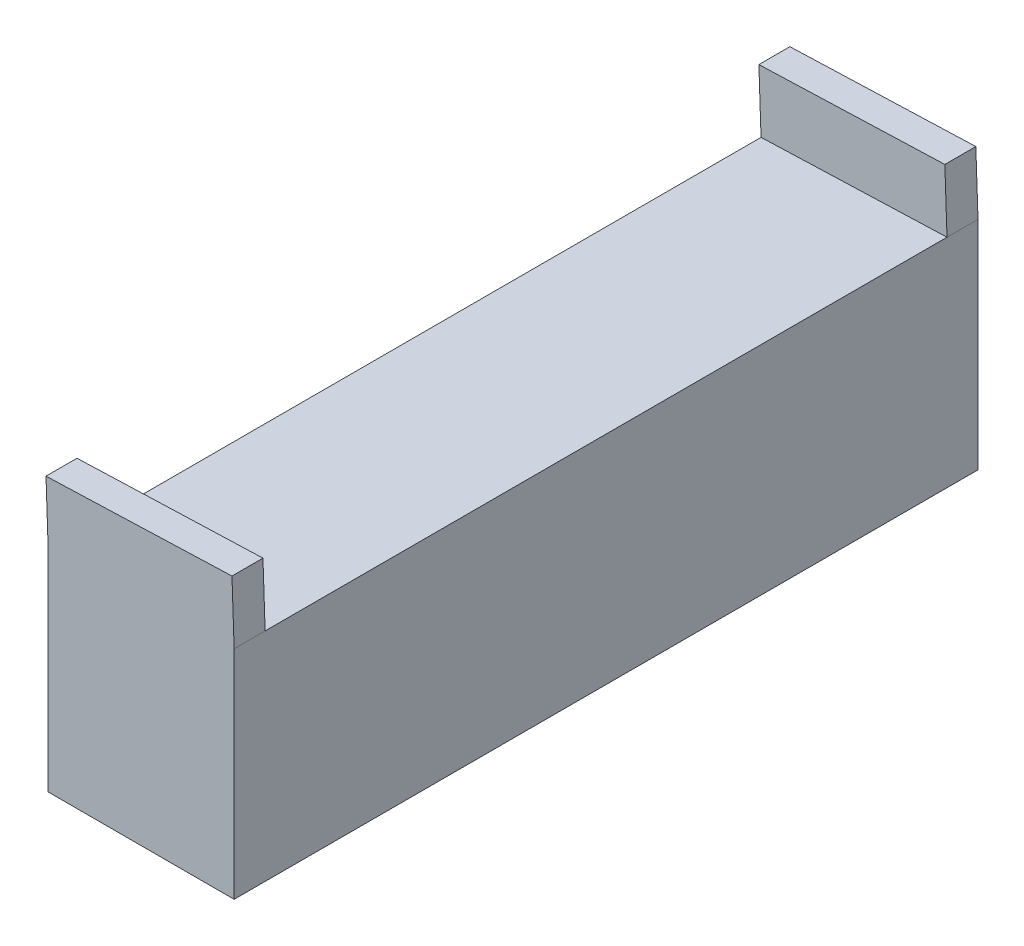
ISO-10303-21;
HEADER;
FILE_DESCRIPTION(('STEP AP214'),'2;1');
FILE_NAME('part.step','',(''),(''),'','','');
FILE_SCHEMA(('AUTOMOTIVE_DESIGN { 1 0 10303 214 1 1 1 1 }'));
ENDSEC;
DATA;
#1=APPLICATION_CONTEXT('core data for automotive mechanical design processes');
#2=APPLICATION_PROTOCOL_DEFINITION('international standard','automotive_design',2000,#1);
#3=PRODUCT_CONTEXT('',#1,'mechanical');
#4=PRODUCT('Part','Part','',(#3));
#5=PRODUCT_RELATED_PRODUCT_CATEGORY('part','',(#4));
#6=PRODUCT_DEFINITION_FORMATION('','',#4);
#7=PRODUCT_DEFINITION_CONTEXT('part definition',#1,'design');
#8=PRODUCT_DEFINITION('design','',#6,#7);
#9=PRODUCT_DEFINITION_SHAPE('','',#8);
#10=(LENGTH_UNIT() NAMED_UNIT(*) SI_UNIT(.MILLI.,.METRE.));
#11=(NAMED_UNIT(*) PLANE_ANGLE_UNIT() SI_UNIT($,.RADIAN.));
#12=(NAMED_UNIT(*) SI_UNIT($,.STERADIAN.) SOLID_ANGLE_UNIT());
#13=UNCERTAINTY_MEASURE_WITH_UNIT(LENGTH_MEASURE(1.E-05),#10,'distance_accuracy_value','');
#14=(GEOMETRIC_REPRESENTATION_CONTEXT(3) GLOBAL_UNCERTAINTY_ASSIGNED_CONTEXT((#13)) GLOBAL_UNIT_ASSIGNED_CONTEXT((#10,
#11,#12)) REPRESENTATION_CONTEXT('',''));
#15=CARTESIAN_POINT('',(0.,0.,0.));
#16=DIRECTION('',(0.,0.,1.));
#17=DIRECTION('',(1.,0.,0.));
#18=AXIS2_PLACEMENT_3D('',#15,#16,#17);
#19=CARTESIAN_POINT('',(738.734501426572,35.,-6544.76084793364));
#20=DIRECTION('',(0.034899496702494,-0.999390827019096,0.));
#21=DIRECTION('',(0.999390827019096,0.034899496702494,0.));
#22=AXIS2_PLACEMENT_3D('',#19,#20,#21);
#23=PLANE('',#22);
#24=DIRECTION('',(-0.999390827019096,-0.0348994967024937,0.));
#25=VECTOR('',#24,1.);
#26=CARTESIAN_POINT('',(738.734501426572,34.9999999999998,-6429.76084793364));
#27=LINE('',#26,#25);
#28=CARTESIAN_POINT('',(738.734501426572,34.9999999999998,-6429.76084793364));
#29=VERTEX_POINT('',#28);
#30=CARTESIAN_POINT('',(708.734501426572,33.9523769152478,-6429.76084793364));
#31=VERTEX_POINT('',#30);
#32=EDGE_CURVE('E244',#29,#31,#27,.T.);
#33=ORIENTED_EDGE('',*,*,#32,.F.);
#34=DIRECTION('',(0.,0.,-1.));
#35=VECTOR('',#34,1.);
#36=CARTESIAN_POINT('',(738.734501426572,35.,-6544.76084793364));
#37=LINE('',#36,#35);
#38=CARTESIAN_POINT('',(738.734501426572,34.9999999999998,-6539.76084793364));
#39=VERTEX_POINT('',#38);
#40=EDGE_CURVE('E194',#29,#39,#37,.T.);
#41=ORIENTED_EDGE('',*,*,#40,.T.);
#42=DIRECTION('',(0.999390827019096,0.0348994967024937,0.));
#43=VECTOR('',#42,1.);
#44=CARTESIAN_POINT('',(708.734501426572,33.9523769152476,-6539.76084793364));
#45=LINE('',#44,#43);
#46=CARTESIAN_POINT('',(708.734501426572,33.9523769152478,-6539.76084793364));
#47=VERTEX_POINT('',#46);
#48=EDGE_CURVE('E62',#47,#39,#45,.T.);
#49=ORIENTED_EDGE('',*,*,#48,.F.);
#50=DIRECTION('',(0.,0.,1.));
#51=VECTOR('',#50,1.);
#52=CARTESIAN_POINT('',(708.734501426572,33.9523769152478,-6544.76084793364));
#53=LINE('',#52,#51);
#54=EDGE_CURVE('E185',#47,#31,#53,.T.);
#55=ORIENTED_EDGE('',*,*,#54,.T.);
#56=EDGE_LOOP('',(#33,#41,#49,#55));
#57=FACE_BOUND('',#56,.T.);
#58=ADVANCED_FACE('F39',(#57),#23,.F.);
#59=CARTESIAN_POINT('',(708.734501426572,35.,-6544.76084793364));
#60=DIRECTION('',(1.,0.,0.));
#61=DIRECTION('',(0.,0.,-1.));
#62=AXIS2_PLACEMENT_3D('',#59,#60,#61);
#63=PLANE('',#62);
#64=DIRECTION('',(0.,-1.,0.));
#65=VECTOR('',#64,1.);
#66=CARTESIAN_POINT('',(708.734501426572,35.,-6424.76084793364));
#67=LINE('',#66,#65);
#68=CARTESIAN_POINT('',(708.734501426572,33.9523769152478,-6424.76084793364));
#69=VERTEX_POINT('',#68);
#70=CARTESIAN_POINT('',(708.734501426572,0.,-6424.76084793364));
#71=VERTEX_POINT('',#70);
#72=EDGE_CURVE('E11',#69,#71,#67,.T.);
#73=ORIENTED_EDGE('',*,*,#72,.F.);
#74=DIRECTION('',(0.,0.,1.));
#75=VECTOR('',#74,1.);
#76=CARTESIAN_POINT('',(708.734501426572,33.9523769152476,-6424.76084793364));
#77=LINE('',#76,#75);
#78=EDGE_CURVE('E55',#31,#69,#77,.T.);
#79=ORIENTED_EDGE('',*,*,#78,.F.);
#80=ORIENTED_EDGE('',*,*,#54,.F.);
#81=CARTESIAN_POINT('',(708.734501426572,33.9523769152478,-6544.76084793364));
#82=VERTEX_POINT('',#81);
#83=EDGE_CURVE('E186',#82,#47,#53,.T.);
#84=ORIENTED_EDGE('',*,*,#83,.F.);
#85=DIRECTION('',(0.,-1.,0.));
#86=VECTOR('',#85,1.);
#87=CARTESIAN_POINT('',(708.734501426572,35.,-6544.76084793364));
#88=LINE('',#87,#86);
#89=CARTESIAN_POINT('',(708.734501426572,0.,-6544.76084793364));
#90=VERTEX_POINT('',#89);
#91=EDGE_CURVE('E193',#82,#90,#88,.T.);
#92=ORIENTED_EDGE('',*,*,#91,.T.);
#93=DIRECTION('',(0.,0.,1.));
#94=VECTOR('',#93,1.);
#95=CARTESIAN_POINT('',(708.734501426572,0.,-6544.76084793364));
#96=LINE('',#95,#94);
#97=EDGE_CURVE('E190',#90,#71,#96,.T.);
#98=ORIENTED_EDGE('',*,*,#97,.T.);
#99=EDGE_LOOP('',(#73,#79,#80,#84,#92,#98));
#100=FACE_BOUND('',#99,.T.);
#101=ADVANCED_FACE('F41',(#100),#63,.F.);
#102=CARTESIAN_POINT('',(708.734501426572,35.,-6424.76084793364));
#103=DIRECTION('',(0.,0.,-1.));
#104=DIRECTION('',(-1.,0.,0.));
#105=AXIS2_PLACEMENT_3D('',#102,#103,#104);
#106=PLANE('',#105);
#107=DIRECTION('',(0.,-1.,0.));
#108=VECTOR('',#107,1.);
#109=CARTESIAN_POINT('',(738.734501426572,35.,-6424.76084793364));
#110=LINE('',#109,#108);
#111=CARTESIAN_POINT('',(738.734501426572,35.,-6424.76084793364));
#112=VERTEX_POINT('',#111);
#113=CARTESIAN_POINT('',(738.734501426572,0.,-6424.76084793364));
#114=VERTEX_POINT('',#113);
#115=EDGE_CURVE('E48',#112,#114,#110,.T.);
#116=ORIENTED_EDGE('',*,*,#115,.F.);
#117=DIRECTION('',(0.0348994967024938,-0.999390827019096,0.));
#118=VECTOR('',#117,1.);
#119=CARTESIAN_POINT('',(738.385506459547,44.9939082701908,-6424.76084793364));
#120=LINE('',#119,#118);
#121=CARTESIAN_POINT('',(738.385506459547,44.9939082701908,-6424.76084793364));
#122=VERTEX_POINT('',#121);
#123=EDGE_CURVE('E252',#122,#112,#120,.T.);
#124=ORIENTED_EDGE('',*,*,#123,.F.);
#125=DIRECTION('',(0.999390827019096,0.0348994967024937,0.));
#126=VECTOR('',#125,1.);
#127=CARTESIAN_POINT('',(738.385506459547,44.9939082701908,-6424.76084793364));
#128=LINE('',#127,#126);
#129=CARTESIAN_POINT('',(708.385506459547,43.9462851854386,-6424.76084793364));
#130=VERTEX_POINT('',#129);
#131=EDGE_CURVE('E134',#130,#122,#128,.T.);
#132=ORIENTED_EDGE('',*,*,#131,.F.);
#133=DIRECTION('',(0.0348994967024938,-0.999390827019096,0.));
#134=VECTOR('',#133,1.);
#135=CARTESIAN_POINT('',(708.385506459547,43.9462851854386,-6424.76084793364));
#136=LINE('',#135,#134);
#137=EDGE_CURVE('E149',#130,#69,#136,.T.);
#138=ORIENTED_EDGE('',*,*,#137,.T.);
#139=ORIENTED_EDGE('',*,*,#72,.T.);
#140=DIRECTION('',(1.,0.,0.));
#141=VECTOR('',#140,1.);
#142=CARTESIAN_POINT('',(708.734501426572,0.,-6424.76084793364));
#143=LINE('',#142,#141);
#144=EDGE_CURVE('E198',#71,#114,#143,.T.);
#145=ORIENTED_EDGE('',*,*,#144,.T.);
#146=EDGE_LOOP('',(#116,#124,#132,#138,#139,#145));
#147=FACE_BOUND('',#146,.T.);
#148=ADVANCED_FACE('F257',(#147),#106,.F.);
#149=CARTESIAN_POINT('',(738.734501426572,35.,-6544.76084793364));
#150=DIRECTION('',(-1.,0.,0.));
#151=DIRECTION('',(0.,0.,1.));
#152=AXIS2_PLACEMENT_3D('',#149,#150,#151);
#153=PLANE('',#152);
#154=DIRECTION('',(0.,0.,-1.));
#155=VECTOR('',#154,1.);
#156=CARTESIAN_POINT('',(738.734501426572,0.,-6544.76084793364));
#157=LINE('',#156,#155);
#158=CARTESIAN_POINT('',(738.734501426572,0.,-6544.76084793364));
#159=VERTEX_POINT('',#158);
#160=EDGE_CURVE('E201',#114,#159,#157,.T.);
#161=ORIENTED_EDGE('',*,*,#160,.T.);
#162=DIRECTION('',(0.,-1.,0.));
#163=VECTOR('',#162,1.);
#164=CARTESIAN_POINT('',(738.734501426572,35.,-6544.76084793364));
#165=LINE('',#164,#163);
#166=CARTESIAN_POINT('',(738.734501426572,35.,-6544.76084793364));
#167=VERTEX_POINT('',#166);
#168=EDGE_CURVE('E210',#167,#159,#165,.T.);
#169=ORIENTED_EDGE('',*,*,#168,.F.);
#170=DIRECTION('',(0.,0.,-1.));
#171=VECTOR('',#170,1.);
#172=CARTESIAN_POINT('',(738.734501426572,34.9999999999998,-6539.76084793364));
#173=LINE('',#172,#171);
#174=EDGE_CURVE('E147',#39,#167,#173,.T.);
#175=ORIENTED_EDGE('',*,*,#174,.F.);
#176=ORIENTED_EDGE('',*,*,#40,.F.);
#177=EDGE_CURVE('E142',#112,#29,#37,.T.);
#178=ORIENTED_EDGE('',*,*,#177,.F.);
#179=ORIENTED_EDGE('',*,*,#115,.T.);
#180=EDGE_LOOP('',(#161,#169,#175,#176,#178,#179));
#181=FACE_BOUND('',#180,.T.);
#182=ADVANCED_FACE('F217',(#181),#153,.F.);
#183=CARTESIAN_POINT('',(708.734501426572,35.,-6544.76084793364));
#184=DIRECTION('',(0.,0.,1.));
#185=DIRECTION('',(1.,0.,0.));
#186=AXIS2_PLACEMENT_3D('',#183,#184,#185);
#187=PLANE('',#186);
#188=ORIENTED_EDGE('',*,*,#91,.F.);
#189=DIRECTION('',(0.0348994967024938,-0.999390827019096,0.));
#190=VECTOR('',#189,1.);
#191=CARTESIAN_POINT('',(708.385506459547,43.9462851854386,-6544.76084793364));
#192=LINE('',#191,#190);
#193=CARTESIAN_POINT('',(708.385506459547,43.9462851854386,-6544.76084793364));
#194=VERTEX_POINT('',#193);
#195=EDGE_CURVE('E165',#194,#82,#192,.T.);
#196=ORIENTED_EDGE('',*,*,#195,.F.);
#197=DIRECTION('',(-0.999390827019096,-0.0348994967024937,0.));
#198=VECTOR('',#197,1.);
#199=CARTESIAN_POINT('',(708.385506459547,43.9462851854386,-6544.76084793364));
#200=LINE('',#199,#198);
#201=CARTESIAN_POINT('',(738.385506459547,44.9939082701908,-6544.76084793364));
#202=VERTEX_POINT('',#201);
#203=EDGE_CURVE('E163',#202,#194,#200,.T.);
#204=ORIENTED_EDGE('',*,*,#203,.F.);
#205=DIRECTION('',(0.0348994967024938,-0.999390827019096,0.));
#206=VECTOR('',#205,1.);
#207=CARTESIAN_POINT('',(738.385506459547,44.9939082701908,-6544.76084793364));
#208=LINE('',#207,#206);
#209=EDGE_CURVE('E173',#202,#167,#208,.T.);
#210=ORIENTED_EDGE('',*,*,#209,.T.);
#211=ORIENTED_EDGE('',*,*,#168,.T.);
#212=DIRECTION('',(-1.,0.,0.));
#213=VECTOR('',#212,1.);
#214=CARTESIAN_POINT('',(708.734501426572,0.,-6544.76084793364));
#215=LINE('',#214,#213);
#216=EDGE_CURVE('E204',#159,#90,#215,.T.);
#217=ORIENTED_EDGE('',*,*,#216,.T.);
#218=EDGE_LOOP('',(#188,#196,#204,#210,#211,#217));
#219=FACE_BOUND('',#218,.T.);
#220=ADVANCED_FACE('F226',(#219),#187,.F.);
#221=CARTESIAN_POINT('',(0.,0.,0.));
#222=DIRECTION('',(0.,1.,0.));
#223=DIRECTION('',(0.,0.,1.));
#224=AXIS2_PLACEMENT_3D('',#221,#222,#223);
#225=PLANE('',#224);
#226=ORIENTED_EDGE('',*,*,#97,.F.);
#227=ORIENTED_EDGE('',*,*,#216,.F.);
#228=ORIENTED_EDGE('',*,*,#160,.F.);
#229=ORIENTED_EDGE('',*,*,#144,.F.);
#230=EDGE_LOOP('',(#226,#227,#228,#229));
#231=FACE_BOUND('',#230,.T.);
#232=ADVANCED_FACE('F223',(#231),#225,.F.);
#233=CARTESIAN_POINT('',(708.385506459547,43.9462851854386,-6539.76084793364));
#234=DIRECTION('',(0.999390827019096,0.0348994967024938,0.));
#235=DIRECTION('',(-0.0348994967024938,0.999390827019096,0.));
#236=AXIS2_PLACEMENT_3D('',#233,#234,#235);
#237=PLANE('',#236);
#238=ORIENTED_EDGE('',*,*,#83,.T.);
#239=DIRECTION('',(0.0348994967024938,-0.999390827019096,0.));
#240=VECTOR('',#239,1.);
#241=CARTESIAN_POINT('',(708.385506459547,43.9462851854386,-6539.76084793364));
#242=LINE('',#241,#240);
#243=CARTESIAN_POINT('',(708.385506459547,43.9462851854386,-6539.76084793364));
#244=VERTEX_POINT('',#243);
#245=EDGE_CURVE('E181',#244,#47,#242,.T.);
#246=ORIENTED_EDGE('',*,*,#245,.F.);
#247=DIRECTION('',(0.,0.,1.));
#248=VECTOR('',#247,1.);
#249=CARTESIAN_POINT('',(708.385506459547,43.9462851854386,-6539.76084793364));
#250=LINE('',#249,#248);
#251=EDGE_CURVE('E153',#194,#244,#250,.T.);
#252=ORIENTED_EDGE('',*,*,#251,.F.);
#253=ORIENTED_EDGE('',*,*,#195,.T.);
#254=EDGE_LOOP('',(#238,#246,#252,#253));
#255=FACE_BOUND('',#254,.T.);
#256=ADVANCED_FACE('F240',(#255),#237,.F.);
#257=CARTESIAN_POINT('',(708.385506459547,43.9462851854386,-6539.76084793364));
#258=DIRECTION('',(0.,0.,-1.));
#259=DIRECTION('',(-1.,0.,0.));
#260=AXIS2_PLACEMENT_3D('',#257,#258,#259);
#261=PLANE('',#260);
#262=ORIENTED_EDGE('',*,*,#48,.T.);
#263=DIRECTION('',(0.0348994967024938,-0.999390827019096,0.));
#264=VECTOR('',#263,1.);
#265=CARTESIAN_POINT('',(738.385506459547,44.9939082701908,-6539.76084793364));
#266=LINE('',#265,#264);
#267=CARTESIAN_POINT('',(738.385506459547,44.9939082701908,-6539.76084793364));
#268=VERTEX_POINT('',#267);
#269=EDGE_CURVE('E177',#268,#39,#266,.T.);
#270=ORIENTED_EDGE('',*,*,#269,.F.);
#271=DIRECTION('',(0.999390827019096,0.0348994967024937,0.));
#272=VECTOR('',#271,1.);
#273=CARTESIAN_POINT('',(708.385506459547,43.9462851854386,-6539.76084793364));
#274=LINE('',#273,#272);
#275=EDGE_CURVE('E157',#244,#268,#274,.T.);
#276=ORIENTED_EDGE('',*,*,#275,.F.);
#277=ORIENTED_EDGE('',*,*,#245,.T.);
#278=EDGE_LOOP('',(#262,#270,#276,#277));
#279=FACE_BOUND('',#278,.T.);
#280=ADVANCED_FACE('F236',(#279),#261,.F.);
#281=CARTESIAN_POINT('',(738.385506459547,44.9939082701908,-6539.76084793364));
#282=DIRECTION('',(-0.999390827019096,-0.0348994967024938,0.));
#283=DIRECTION('',(0.0348994967024938,-0.999390827019096,0.));
#284=AXIS2_PLACEMENT_3D('',#281,#282,#283);
#285=PLANE('',#284);
#286=ORIENTED_EDGE('',*,*,#174,.T.);
#287=ORIENTED_EDGE('',*,*,#209,.F.);
#288=DIRECTION('',(0.,0.,-1.));
#289=VECTOR('',#288,1.);
#290=CARTESIAN_POINT('',(738.385506459547,44.9939082701908,-6539.76084793364));
#291=LINE('',#290,#289);
#292=EDGE_CURVE('E160',#268,#202,#291,.T.);
#293=ORIENTED_EDGE('',*,*,#292,.F.);
#294=ORIENTED_EDGE('',*,*,#269,.T.);
#295=EDGE_LOOP('',(#286,#287,#293,#294));
#296=FACE_BOUND('',#295,.T.);
#297=ADVANCED_FACE('F232',(#296),#285,.F.);
#298=CARTESIAN_POINT('',(-0.669973199142786,19.1855222234221,0.));
#299=DIRECTION('',(0.0348994967024936,-0.999390827019096,0.));
#300=DIRECTION('',(0.999390827019096,0.0348994967024936,0.));
#301=AXIS2_PLACEMENT_3D('',#298,#299,#300);
#302=PLANE('',#301);
#303=ORIENTED_EDGE('',*,*,#251,.T.);
#304=ORIENTED_EDGE('',*,*,#275,.T.);
#305=ORIENTED_EDGE('',*,*,#292,.T.);
#306=ORIENTED_EDGE('',*,*,#203,.T.);
#307=EDGE_LOOP('',(#303,#304,#305,#306));
#308=FACE_BOUND('',#307,.T.);
#309=ADVANCED_FACE('F316',(#308),#302,.F.);
#310=CARTESIAN_POINT('',(738.385506459547,44.9939082701908,-6424.76084793364));
#311=DIRECTION('',(-0.999390827019096,-0.0348994967024938,0.));
#312=DIRECTION('',(0.0348994967024938,-0.999390827019096,0.));
#313=AXIS2_PLACEMENT_3D('',#310,#311,#312);
#314=PLANE('',#313);
#315=ORIENTED_EDGE('',*,*,#177,.T.);
#316=DIRECTION('',(0.0348994967024938,-0.999390827019096,0.));
#317=VECTOR('',#316,1.);
#318=CARTESIAN_POINT('',(738.385506459547,44.9939082701908,-6429.76084793364));
#319=LINE('',#318,#317);
#320=CARTESIAN_POINT('',(738.385506459547,44.9939082701908,-6429.76084793364));
#321=VERTEX_POINT('',#320);
#322=EDGE_CURVE('E121',#321,#29,#319,.T.);
#323=ORIENTED_EDGE('',*,*,#322,.F.);
#324=DIRECTION('',(0.,0.,-1.));
#325=VECTOR('',#324,1.);
#326=CARTESIAN_POINT('',(738.385506459547,44.9939082701908,-6424.76084793364));
#327=LINE('',#326,#325);
#328=EDGE_CURVE('E129',#122,#321,#327,.T.);
#329=ORIENTED_EDGE('',*,*,#328,.F.);
#330=ORIENTED_EDGE('',*,*,#123,.T.);
#331=EDGE_LOOP('',(#315,#323,#329,#330));
#332=FACE_BOUND('',#331,.T.);
#333=ADVANCED_FACE('F140',(#332),#314,.F.);
#334=CARTESIAN_POINT('',(738.385506459547,44.9939082701908,-6429.76084793364));
#335=DIRECTION('',(0.,0.,1.));
#336=DIRECTION('',(1.,0.,0.));
#337=AXIS2_PLACEMENT_3D('',#334,#335,#336);
#338=PLANE('',#337);
#339=ORIENTED_EDGE('',*,*,#32,.T.);
#340=DIRECTION('',(0.0348994967024938,-0.999390827019096,0.));
#341=VECTOR('',#340,1.);
#342=CARTESIAN_POINT('',(708.385506459547,43.9462851854386,-6429.76084793364));
#343=LINE('',#342,#341);
#344=CARTESIAN_POINT('',(708.385506459547,43.9462851854386,-6429.76084793364));
#345=VERTEX_POINT('',#344);
#346=EDGE_CURVE('E124',#345,#31,#343,.T.);
#347=ORIENTED_EDGE('',*,*,#346,.F.);
#348=DIRECTION('',(-0.999390827019096,-0.0348994967024937,0.));
#349=VECTOR('',#348,1.);
#350=CARTESIAN_POINT('',(738.385506459547,44.9939082701908,-6429.76084793364));
#351=LINE('',#350,#349);
#352=EDGE_CURVE('E116',#321,#345,#351,.T.);
#353=ORIENTED_EDGE('',*,*,#352,.F.);
#354=ORIENTED_EDGE('',*,*,#322,.T.);
#355=EDGE_LOOP('',(#339,#347,#353,#354));
#356=FACE_BOUND('',#355,.T.);
#357=ADVANCED_FACE('F119',(#356),#338,.F.);
#358=CARTESIAN_POINT('',(708.385506459547,43.9462851854386,-6424.76084793364));
#359=DIRECTION('',(0.999390827019096,0.0348994967024938,0.));
#360=DIRECTION('',(-0.0348994967024938,0.999390827019096,0.));
#361=AXIS2_PLACEMENT_3D('',#358,#359,#360);
#362=PLANE('',#361);
#363=ORIENTED_EDGE('',*,*,#78,.T.);
#364=ORIENTED_EDGE('',*,*,#137,.F.);
#365=DIRECTION('',(0.,0.,1.));
#366=VECTOR('',#365,1.);
#367=CARTESIAN_POINT('',(708.385506459547,43.9462851854386,-6424.76084793364));
#368=LINE('',#367,#366);
#369=EDGE_CURVE('E128',#345,#130,#368,.T.);
#370=ORIENTED_EDGE('',*,*,#369,.F.);
#371=ORIENTED_EDGE('',*,*,#346,.T.);
#372=EDGE_LOOP('',(#363,#364,#370,#371));
#373=FACE_BOUND('',#372,.T.);
#374=ADVANCED_FACE('F259',(#373),#362,.F.);
#375=CARTESIAN_POINT('',(-0.669973199142786,19.1855222234221,0.));
#376=DIRECTION('',(-0.0348994967024936,0.999390827019096,0.));
#377=DIRECTION('',(-0.999390827019096,-0.0348994967024936,0.));
#378=AXIS2_PLACEMENT_3D('',#375,#376,#377);
#379=PLANE('',#378);
#380=ORIENTED_EDGE('',*,*,#328,.T.);
#381=ORIENTED_EDGE('',*,*,#352,.T.);
#382=ORIENTED_EDGE('',*,*,#369,.T.);
#383=ORIENTED_EDGE('',*,*,#131,.T.);
#384=EDGE_LOOP('',(#380,#381,#382,#383));
#385=FACE_BOUND('',#384,.T.);
#386=ADVANCED_FACE('F132',(#385),#379,.T.);
#387=CLOSED_SHELL('',(#58,#101,#148,#182,#220,#232,#256,#280,#297,#309,#333,#357,#374,#386));
#388=MANIFOLD_SOLID_BREP('B2',#387);
#389=ADVANCED_BREP_SHAPE_REPRESENTATION('',(#18,#388),#14);
#390=SHAPE_DEFINITION_REPRESENTATION(#9,#389);
ENDSEC;
END-ISO-10303-21;
